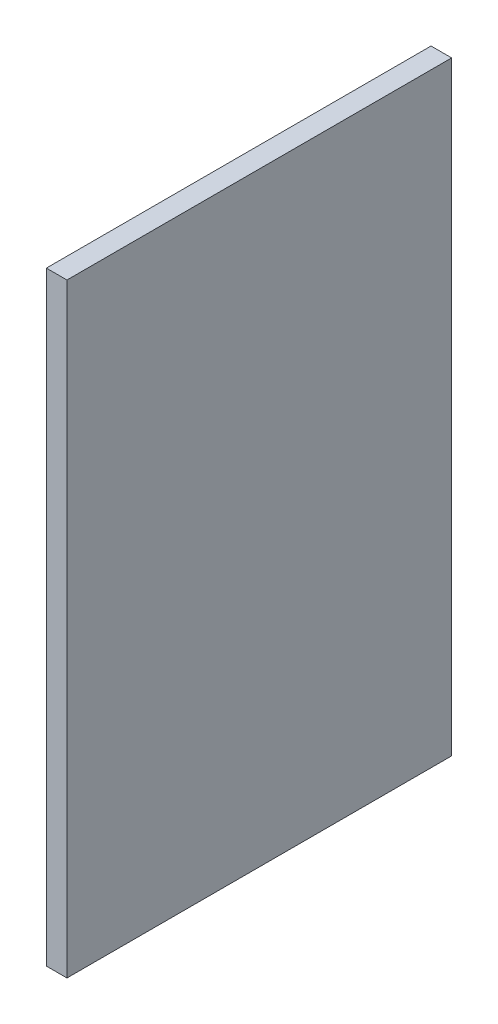
ISO-10303-21;
HEADER;
FILE_DESCRIPTION(('STEP AP214'),'2;1');
FILE_NAME('part.step','',(''),(''),'','','');
FILE_SCHEMA(('AUTOMOTIVE_DESIGN { 1 0 10303 214 1 1 1 1 }'));
ENDSEC;
DATA;
#1=APPLICATION_CONTEXT('core data for automotive mechanical design processes');
#2=APPLICATION_PROTOCOL_DEFINITION('international standard','automotive_design',2000,#1);
#3=PRODUCT_CONTEXT('',#1,'mechanical');
#4=PRODUCT('Part','Part','',(#3));
#5=PRODUCT_RELATED_PRODUCT_CATEGORY('part','',(#4));
#6=PRODUCT_DEFINITION_FORMATION('','',#4);
#7=PRODUCT_DEFINITION_CONTEXT('part definition',#1,'design');
#8=PRODUCT_DEFINITION('design','',#6,#7);
#9=PRODUCT_DEFINITION_SHAPE('','',#8);
#10=(LENGTH_UNIT() NAMED_UNIT(*) SI_UNIT(.MILLI.,.METRE.));
#11=(NAMED_UNIT(*) PLANE_ANGLE_UNIT() SI_UNIT($,.RADIAN.));
#12=(NAMED_UNIT(*) SI_UNIT($,.STERADIAN.) SOLID_ANGLE_UNIT());
#13=UNCERTAINTY_MEASURE_WITH_UNIT(LENGTH_MEASURE(1.E-05),#10,'distance_accuracy_value','');
#14=(GEOMETRIC_REPRESENTATION_CONTEXT(3) GLOBAL_UNCERTAINTY_ASSIGNED_CONTEXT((#13)) GLOBAL_UNIT_ASSIGNED_CONTEXT((#10,
#11,#12)) REPRESENTATION_CONTEXT('',''));
#15=CARTESIAN_POINT('',(0.,0.,0.));
#16=DIRECTION('',(0.,0.,1.));
#17=DIRECTION('',(1.,0.,0.));
#18=AXIS2_PLACEMENT_3D('',#15,#16,#17);
#19=CARTESIAN_POINT('',(19.05,279.4,177.8));
#20=DIRECTION('',(0.,0.,-1.));
#21=DIRECTION('',(0.,1.,0.));
#22=AXIS2_PLACEMENT_3D('',#19,#20,#21);
#23=PLANE('',#22);
#24=DIRECTION('',(0.,-1.,0.));
#25=VECTOR('',#24,1.);
#26=CARTESIAN_POINT('',(0.,279.4,177.8));
#27=LINE('',#26,#25);
#28=CARTESIAN_POINT('',(0.,279.4,177.8));
#29=VERTEX_POINT('',#28);
#30=CARTESIAN_POINT('',(0.,-279.4,177.8));
#31=VERTEX_POINT('',#30);
#32=EDGE_CURVE('E95',#29,#31,#27,.T.);
#33=ORIENTED_EDGE('',*,*,#32,.T.);
#34=DIRECTION('',(-1.,0.,0.));
#35=VECTOR('',#34,1.);
#36=CARTESIAN_POINT('',(19.05,-279.4,177.8));
#37=LINE('',#36,#35);
#38=CARTESIAN_POINT('',(19.05,-279.4,177.8));
#39=VERTEX_POINT('',#38);
#40=EDGE_CURVE('E11',#39,#31,#37,.T.);
#41=ORIENTED_EDGE('',*,*,#40,.F.);
#42=DIRECTION('',(0.,-1.,0.));
#43=VECTOR('',#42,1.);
#44=CARTESIAN_POINT('',(19.05,279.4,177.8));
#45=LINE('',#44,#43);
#46=CARTESIAN_POINT('',(19.05,279.4,177.8));
#47=VERTEX_POINT('',#46);
#48=EDGE_CURVE('E83',#47,#39,#45,.T.);
#49=ORIENTED_EDGE('',*,*,#48,.F.);
#50=DIRECTION('',(-1.,0.,0.));
#51=VECTOR('',#50,1.);
#52=CARTESIAN_POINT('',(19.05,279.4,177.8));
#53=LINE('',#52,#51);
#54=EDGE_CURVE('E91',#47,#29,#53,.T.);
#55=ORIENTED_EDGE('',*,*,#54,.T.);
#56=EDGE_LOOP('',(#33,#41,#49,#55));
#57=FACE_BOUND('',#56,.T.);
#58=ADVANCED_FACE('F32',(#57),#23,.F.);
#59=CARTESIAN_POINT('',(19.05,-279.4,-177.8));
#60=DIRECTION('',(0.,1.,0.));
#61=DIRECTION('',(0.,0.,1.));
#62=AXIS2_PLACEMENT_3D('',#59,#60,#61);
#63=PLANE('',#62);
#64=DIRECTION('',(0.,0.,-1.));
#65=VECTOR('',#64,1.);
#66=CARTESIAN_POINT('',(0.,-279.4,-177.8));
#67=LINE('',#66,#65);
#68=CARTESIAN_POINT('',(0.,-279.4,-177.8));
#69=VERTEX_POINT('',#68);
#70=EDGE_CURVE('E87',#31,#69,#67,.T.);
#71=ORIENTED_EDGE('',*,*,#70,.T.);
#72=DIRECTION('',(-1.,0.,0.));
#73=VECTOR('',#72,1.);
#74=CARTESIAN_POINT('',(19.05,-279.4,-177.8));
#75=LINE('',#74,#73);
#76=CARTESIAN_POINT('',(19.05,-279.4,-177.8));
#77=VERTEX_POINT('',#76);
#78=EDGE_CURVE('E40',#77,#69,#75,.T.);
#79=ORIENTED_EDGE('',*,*,#78,.F.);
#80=DIRECTION('',(0.,0.,-1.));
#81=VECTOR('',#80,1.);
#82=CARTESIAN_POINT('',(19.05,-279.4,-177.8));
#83=LINE('',#82,#81);
#84=EDGE_CURVE('E78',#39,#77,#83,.T.);
#85=ORIENTED_EDGE('',*,*,#84,.F.);
#86=ORIENTED_EDGE('',*,*,#40,.T.);
#87=EDGE_LOOP('',(#71,#79,#85,#86));
#88=FACE_BOUND('',#87,.T.);
#89=ADVANCED_FACE('F86',(#88),#63,.F.);
#90=CARTESIAN_POINT('',(19.05,279.4,-177.8));
#91=DIRECTION('',(0.,0.,1.));
#92=DIRECTION('',(0.,-1.,0.));
#93=AXIS2_PLACEMENT_3D('',#90,#91,#92);
#94=PLANE('',#93);
#95=DIRECTION('',(0.,1.,0.));
#96=VECTOR('',#95,1.);
#97=CARTESIAN_POINT('',(0.,279.4,-177.8));
#98=LINE('',#97,#96);
#99=CARTESIAN_POINT('',(0.,279.4,-177.8));
#100=VERTEX_POINT('',#99);
#101=EDGE_CURVE('E65',#69,#100,#98,.T.);
#102=ORIENTED_EDGE('',*,*,#101,.T.);
#103=DIRECTION('',(-1.,0.,0.));
#104=VECTOR('',#103,1.);
#105=CARTESIAN_POINT('',(19.05,279.4,-177.8));
#106=LINE('',#105,#104);
#107=CARTESIAN_POINT('',(19.05,279.4,-177.8));
#108=VERTEX_POINT('',#107);
#109=EDGE_CURVE('E88',#108,#100,#106,.T.);
#110=ORIENTED_EDGE('',*,*,#109,.F.);
#111=DIRECTION('',(0.,1.,0.));
#112=VECTOR('',#111,1.);
#113=CARTESIAN_POINT('',(19.05,279.4,-177.8));
#114=LINE('',#113,#112);
#115=EDGE_CURVE('E81',#77,#108,#114,.T.);
#116=ORIENTED_EDGE('',*,*,#115,.F.);
#117=ORIENTED_EDGE('',*,*,#78,.T.);
#118=EDGE_LOOP('',(#102,#110,#116,#117));
#119=FACE_BOUND('',#118,.T.);
#120=ADVANCED_FACE('F89',(#119),#94,.F.);
#121=CARTESIAN_POINT('',(19.05,279.4,-177.8));
#122=DIRECTION('',(0.,-1.,0.));
#123=DIRECTION('',(0.,0.,-1.));
#124=AXIS2_PLACEMENT_3D('',#121,#122,#123);
#125=PLANE('',#124);
#126=DIRECTION('',(0.,0.,1.));
#127=VECTOR('',#126,1.);
#128=CARTESIAN_POINT('',(0.,279.4,-177.8));
#129=LINE('',#128,#127);
#130=EDGE_CURVE('E71',#100,#29,#129,.T.);
#131=ORIENTED_EDGE('',*,*,#130,.T.);
#132=ORIENTED_EDGE('',*,*,#54,.F.);
#133=DIRECTION('',(0.,0.,1.));
#134=VECTOR('',#133,1.);
#135=CARTESIAN_POINT('',(19.05,279.4,-177.8));
#136=LINE('',#135,#134);
#137=EDGE_CURVE('E48',#108,#47,#136,.T.);
#138=ORIENTED_EDGE('',*,*,#137,.F.);
#139=ORIENTED_EDGE('',*,*,#109,.T.);
#140=EDGE_LOOP('',(#131,#132,#138,#139));
#141=FACE_BOUND('',#140,.T.);
#142=ADVANCED_FACE('F102',(#141),#125,.F.);
#143=CARTESIAN_POINT('',(19.05,0.,0.));
#144=DIRECTION('',(-1.,0.,0.));
#145=DIRECTION('',(0.,0.,1.));
#146=AXIS2_PLACEMENT_3D('',#143,#144,#145);
#147=PLANE('',#146);
#148=ORIENTED_EDGE('',*,*,#48,.T.);
#149=ORIENTED_EDGE('',*,*,#84,.T.);
#150=ORIENTED_EDGE('',*,*,#115,.T.);
#151=ORIENTED_EDGE('',*,*,#137,.T.);
#152=EDGE_LOOP('',(#148,#149,#150,#151));
#153=FACE_BOUND('',#152,.T.);
#154=ADVANCED_FACE('F79',(#153),#147,.F.);
#155=CARTESIAN_POINT('',(0.,0.,0.));
#156=DIRECTION('',(-1.,0.,0.));
#157=DIRECTION('',(0.,0.,1.));
#158=AXIS2_PLACEMENT_3D('',#155,#156,#157);
#159=PLANE('',#158);
#160=ORIENTED_EDGE('',*,*,#32,.F.);
#161=ORIENTED_EDGE('',*,*,#130,.F.);
#162=ORIENTED_EDGE('',*,*,#101,.F.);
#163=ORIENTED_EDGE('',*,*,#70,.F.);
#164=EDGE_LOOP('',(#160,#161,#162,#163));
#165=FACE_BOUND('',#164,.T.);
#166=ADVANCED_FACE('F105',(#165),#159,.T.);
#167=CLOSED_SHELL('',(#58,#89,#120,#142,#154,#166));
#168=MANIFOLD_SOLID_BREP('B2',#167);
#169=ADVANCED_BREP_SHAPE_REPRESENTATION('',(#18,#168),#14);
#170=SHAPE_DEFINITION_REPRESENTATION(#9,#169);
ENDSEC;
END-ISO-10303-21;
